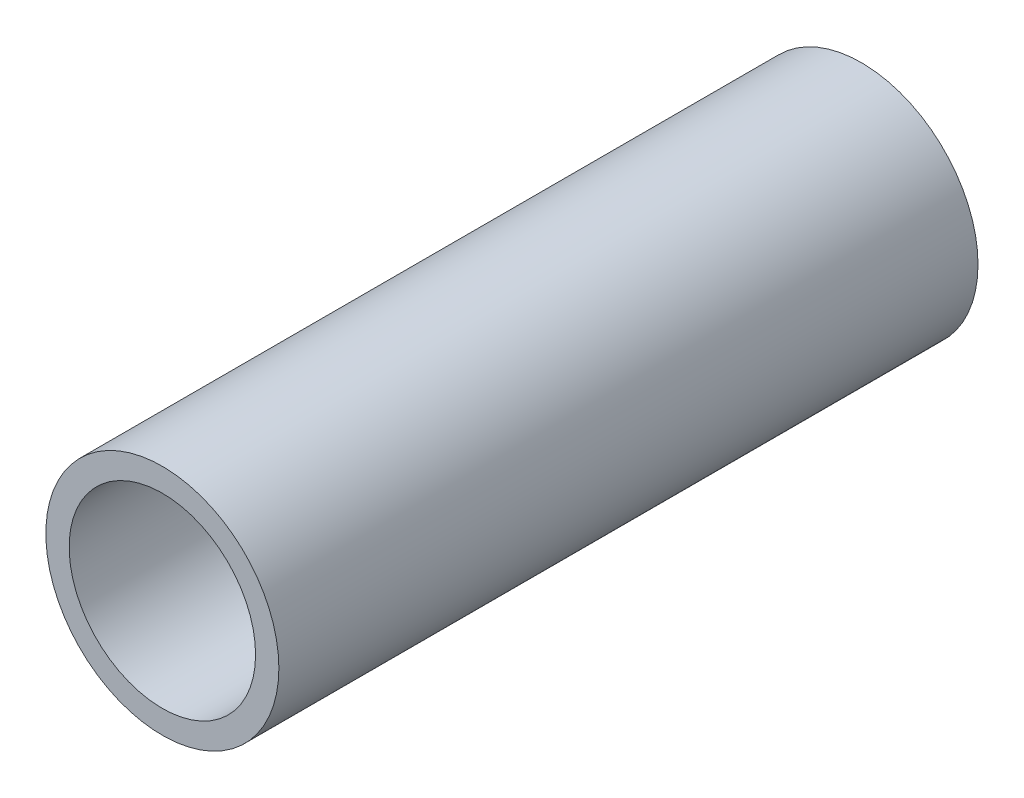
ISO-10303-21;
HEADER;
FILE_DESCRIPTION(('STEP AP214'),'2;1');
FILE_NAME('part.step','',(''),(''),'','','');
FILE_SCHEMA(('AUTOMOTIVE_DESIGN { 1 0 10303 214 1 1 1 1 }'));
ENDSEC;
DATA;
#1=APPLICATION_CONTEXT('core data for automotive mechanical design processes');
#2=APPLICATION_PROTOCOL_DEFINITION('international standard','automotive_design',2000,#1);
#3=PRODUCT_CONTEXT('',#1,'mechanical');
#4=PRODUCT('Part','Part','',(#3));
#5=PRODUCT_RELATED_PRODUCT_CATEGORY('part','',(#4));
#6=PRODUCT_DEFINITION_FORMATION('','',#4);
#7=PRODUCT_DEFINITION_CONTEXT('part definition',#1,'design');
#8=PRODUCT_DEFINITION('design','',#6,#7);
#9=PRODUCT_DEFINITION_SHAPE('','',#8);
#10=(LENGTH_UNIT() NAMED_UNIT(*) SI_UNIT(.MILLI.,.METRE.));
#11=(NAMED_UNIT(*) PLANE_ANGLE_UNIT() SI_UNIT($,.RADIAN.));
#12=(NAMED_UNIT(*) SI_UNIT($,.STERADIAN.) SOLID_ANGLE_UNIT());
#13=UNCERTAINTY_MEASURE_WITH_UNIT(LENGTH_MEASURE(1.E-05),#10,'distance_accuracy_value','');
#14=(GEOMETRIC_REPRESENTATION_CONTEXT(3) GLOBAL_UNCERTAINTY_ASSIGNED_CONTEXT((#13)) GLOBAL_UNIT_ASSIGNED_CONTEXT((#10,
#11,#12)) REPRESENTATION_CONTEXT('',''));
#15=CARTESIAN_POINT('',(0.,0.,0.));
#16=DIRECTION('',(0.,0.,1.));
#17=DIRECTION('',(1.,0.,0.));
#18=AXIS2_PLACEMENT_3D('',#15,#16,#17);
#19=CARTESIAN_POINT('',(0.,0.,150.));
#20=DIRECTION('',(0.,0.,1.));
#21=DIRECTION('',(1.,0.,0.));
#22=AXIS2_PLACEMENT_3D('',#19,#20,#21);
#23=PLANE('',#22);
#24=CARTESIAN_POINT('',(0.,0.,150.));
#25=DIRECTION('',(0.,0.,1.));
#26=DIRECTION('',(1.,0.,0.));
#27=AXIS2_PLACEMENT_3D('',#24,#25,#26);
#28=CIRCLE('',#27,25.);
#29=CARTESIAN_POINT('',(25.,0.,150.));
#30=VERTEX_POINT('',#29);
#31=EDGE_CURVE('E10',#30,#30,#28,.T.);
#32=ORIENTED_EDGE('',*,*,#31,.T.);
#33=EDGE_LOOP('',(#32));
#34=FACE_BOUND('',#33,.T.);
#35=CARTESIAN_POINT('',(0.,0.,150.));
#36=DIRECTION('',(0.,0.,1.));
#37=DIRECTION('',(1.,0.,0.));
#38=AXIS2_PLACEMENT_3D('',#35,#36,#37);
#39=CIRCLE('',#38,20.);
#40=CARTESIAN_POINT('',(20.,0.,150.));
#41=VERTEX_POINT('',#40);
#42=EDGE_CURVE('E45',#41,#41,#39,.T.);
#43=ORIENTED_EDGE('',*,*,#42,.F.);
#44=EDGE_LOOP('',(#43));
#45=FACE_BOUND('',#44,.T.);
#46=ADVANCED_FACE('F34',(#34,#45),#23,.T.);
#47=CARTESIAN_POINT('',(0.,0.,0.));
#48=DIRECTION('',(0.,0.,1.));
#49=DIRECTION('',(1.,0.,0.));
#50=AXIS2_PLACEMENT_3D('',#47,#48,#49);
#51=PLANE('',#50);
#52=CARTESIAN_POINT('',(0.,0.,0.));
#53=DIRECTION('',(0.,0.,1.));
#54=DIRECTION('',(1.,0.,0.));
#55=AXIS2_PLACEMENT_3D('',#52,#53,#54);
#56=CIRCLE('',#55,25.);
#57=CARTESIAN_POINT('',(25.,0.,0.));
#58=VERTEX_POINT('',#57);
#59=EDGE_CURVE('E38',#58,#58,#56,.T.);
#60=ORIENTED_EDGE('',*,*,#59,.F.);
#61=EDGE_LOOP('',(#60));
#62=FACE_BOUND('',#61,.T.);
#63=CARTESIAN_POINT('',(0.,0.,0.));
#64=DIRECTION('',(0.,0.,1.));
#65=DIRECTION('',(1.,0.,0.));
#66=AXIS2_PLACEMENT_3D('',#63,#64,#65);
#67=CIRCLE('',#66,20.);
#68=CARTESIAN_POINT('',(20.,0.,0.));
#69=VERTEX_POINT('',#68);
#70=EDGE_CURVE('E47',#69,#69,#67,.T.);
#71=ORIENTED_EDGE('',*,*,#70,.T.);
#72=EDGE_LOOP('',(#71));
#73=FACE_BOUND('',#72,.T.);
#74=ADVANCED_FACE('F57',(#62,#73),#51,.F.);
#75=CARTESIAN_POINT('',(0.,0.,150.));
#76=DIRECTION('',(0.,0.,-1.));
#77=DIRECTION('',(-1.,0.,0.));
#78=AXIS2_PLACEMENT_3D('',#75,#76,#77);
#79=CYLINDRICAL_SURFACE('',#78,25.);
#80=ORIENTED_EDGE('',*,*,#31,.F.);
#81=EDGE_LOOP('',(#80));
#82=FACE_BOUND('',#81,.T.);
#83=ORIENTED_EDGE('',*,*,#59,.T.);
#84=EDGE_LOOP('',(#83));
#85=FACE_BOUND('',#84,.T.);
#86=ADVANCED_FACE('F36',(#82,#85),#79,.T.);
#87=CARTESIAN_POINT('',(0.,0.,150.));
#88=DIRECTION('',(0.,0.,-1.));
#89=DIRECTION('',(-1.,0.,0.));
#90=AXIS2_PLACEMENT_3D('',#87,#88,#89);
#91=CYLINDRICAL_SURFACE('',#90,20.);
#92=ORIENTED_EDGE('',*,*,#42,.T.);
#93=EDGE_LOOP('',(#92));
#94=FACE_BOUND('',#93,.T.);
#95=ORIENTED_EDGE('',*,*,#70,.F.);
#96=EDGE_LOOP('',(#95));
#97=FACE_BOUND('',#96,.T.);
#98=ADVANCED_FACE('F53',(#94,#97),#91,.F.);
#99=CLOSED_SHELL('',(#46,#74,#86,#98));
#100=MANIFOLD_SOLID_BREP('B2',#99);
#101=ADVANCED_BREP_SHAPE_REPRESENTATION('',(#18,#100),#14);
#102=SHAPE_DEFINITION_REPRESENTATION(#9,#101);
ENDSEC;
END-ISO-10303-21;
